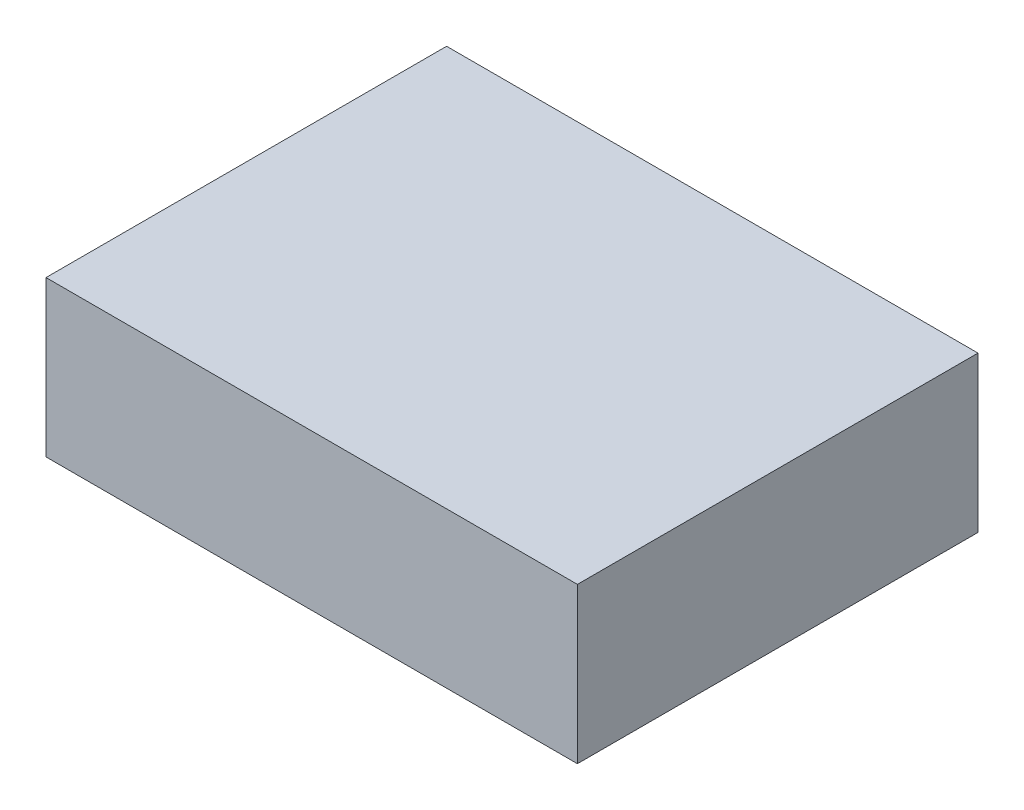
ISO-10303-21;
HEADER;
FILE_DESCRIPTION(('STEP AP214'),'2;1');
FILE_NAME('part.step','',(''),(''),'','','');
FILE_SCHEMA(('AUTOMOTIVE_DESIGN { 1 0 10303 214 1 1 1 1 }'));
ENDSEC;
DATA;
#1=APPLICATION_CONTEXT('core data for automotive mechanical design processes');
#2=APPLICATION_PROTOCOL_DEFINITION('international standard','automotive_design',2000,#1);
#3=PRODUCT_CONTEXT('',#1,'mechanical');
#4=PRODUCT('Part','Part','',(#3));
#5=PRODUCT_RELATED_PRODUCT_CATEGORY('part','',(#4));
#6=PRODUCT_DEFINITION_FORMATION('','',#4);
#7=PRODUCT_DEFINITION_CONTEXT('part definition',#1,'design');
#8=PRODUCT_DEFINITION('design','',#6,#7);
#9=PRODUCT_DEFINITION_SHAPE('','',#8);
#10=(LENGTH_UNIT() NAMED_UNIT(*) SI_UNIT(.MILLI.,.METRE.));
#11=(NAMED_UNIT(*) PLANE_ANGLE_UNIT() SI_UNIT($,.RADIAN.));
#12=(NAMED_UNIT(*) SI_UNIT($,.STERADIAN.) SOLID_ANGLE_UNIT());
#13=UNCERTAINTY_MEASURE_WITH_UNIT(LENGTH_MEASURE(1.E-05),#10,'distance_accuracy_value','');
#14=(GEOMETRIC_REPRESENTATION_CONTEXT(3) GLOBAL_UNCERTAINTY_ASSIGNED_CONTEXT((#13)) GLOBAL_UNIT_ASSIGNED_CONTEXT((#10,
#11,#12)) REPRESENTATION_CONTEXT('',''));
#15=CARTESIAN_POINT('',(0.,0.,0.));
#16=DIRECTION('',(0.,0.,1.));
#17=DIRECTION('',(1.,0.,0.));
#18=AXIS2_PLACEMENT_3D('',#15,#16,#17);
#19=CARTESIAN_POINT('',(65.,38.,-49.));
#20=DIRECTION('',(0.,0.,1.));
#21=DIRECTION('',(1.,0.,0.));
#22=AXIS2_PLACEMENT_3D('',#19,#20,#21);
#23=PLANE('',#22);
#24=DIRECTION('',(-1.,0.,0.));
#25=VECTOR('',#24,1.);
#26=CARTESIAN_POINT('',(65.,0.,-49.));
#27=LINE('',#26,#25);
#28=CARTESIAN_POINT('',(65.,0.,-49.));
#29=VERTEX_POINT('',#28);
#30=CARTESIAN_POINT('',(-65.,0.,-49.));
#31=VERTEX_POINT('',#30);
#32=EDGE_CURVE('E113',#29,#31,#27,.T.);
#33=ORIENTED_EDGE('',*,*,#32,.T.);
#34=DIRECTION('',(0.,-1.,0.));
#35=VECTOR('',#34,1.);
#36=CARTESIAN_POINT('',(-65.,38.,-49.));
#37=LINE('',#36,#35);
#38=CARTESIAN_POINT('',(-65.,38.,-49.));
#39=VERTEX_POINT('',#38);
#40=EDGE_CURVE('E11',#39,#31,#37,.T.);
#41=ORIENTED_EDGE('',*,*,#40,.F.);
#42=DIRECTION('',(-1.,0.,0.));
#43=VECTOR('',#42,1.);
#44=CARTESIAN_POINT('',(65.,38.,-49.));
#45=LINE('',#44,#43);
#46=CARTESIAN_POINT('',(65.,38.,-49.));
#47=VERTEX_POINT('',#46);
#48=EDGE_CURVE('E97',#47,#39,#45,.T.);
#49=ORIENTED_EDGE('',*,*,#48,.F.);
#50=DIRECTION('',(0.,-1.,0.));
#51=VECTOR('',#50,1.);
#52=CARTESIAN_POINT('',(65.,38.,-49.));
#53=LINE('',#52,#51);
#54=EDGE_CURVE('E109',#47,#29,#53,.T.);
#55=ORIENTED_EDGE('',*,*,#54,.T.);
#56=EDGE_LOOP('',(#33,#41,#49,#55));
#57=FACE_BOUND('',#56,.T.);
#58=ADVANCED_FACE('F45',(#57),#23,.F.);
#59=CARTESIAN_POINT('',(-65.,38.,-49.));
#60=DIRECTION('',(1.,0.,0.));
#61=DIRECTION('',(0.,0.,-1.));
#62=AXIS2_PLACEMENT_3D('',#59,#60,#61);
#63=PLANE('',#62);
#64=DIRECTION('',(0.,0.,1.));
#65=VECTOR('',#64,1.);
#66=CARTESIAN_POINT('',(-65.,0.,-49.));
#67=LINE('',#66,#65);
#68=CARTESIAN_POINT('',(-65.,0.,49.));
#69=VERTEX_POINT('',#68);
#70=EDGE_CURVE('E102',#31,#69,#67,.T.);
#71=ORIENTED_EDGE('',*,*,#70,.T.);
#72=DIRECTION('',(0.,-1.,0.));
#73=VECTOR('',#72,1.);
#74=CARTESIAN_POINT('',(-65.,38.,49.));
#75=LINE('',#74,#73);
#76=CARTESIAN_POINT('',(-65.,38.,49.));
#77=VERTEX_POINT('',#76);
#78=EDGE_CURVE('E54',#77,#69,#75,.T.);
#79=ORIENTED_EDGE('',*,*,#78,.F.);
#80=DIRECTION('',(0.,0.,1.));
#81=VECTOR('',#80,1.);
#82=CARTESIAN_POINT('',(-65.,38.,-49.));
#83=LINE('',#82,#81);
#84=EDGE_CURVE('E92',#39,#77,#83,.T.);
#85=ORIENTED_EDGE('',*,*,#84,.F.);
#86=ORIENTED_EDGE('',*,*,#40,.T.);
#87=EDGE_LOOP('',(#71,#79,#85,#86));
#88=FACE_BOUND('',#87,.T.);
#89=ADVANCED_FACE('F101',(#88),#63,.F.);
#90=CARTESIAN_POINT('',(-65.,38.,49.));
#91=DIRECTION('',(0.,0.,-1.));
#92=DIRECTION('',(-1.,0.,0.));
#93=AXIS2_PLACEMENT_3D('',#90,#91,#92);
#94=PLANE('',#93);
#95=DIRECTION('',(1.,0.,0.));
#96=VECTOR('',#95,1.);
#97=CARTESIAN_POINT('',(-65.,0.,49.));
#98=LINE('',#97,#96);
#99=CARTESIAN_POINT('',(65.,0.,49.));
#100=VERTEX_POINT('',#99);
#101=EDGE_CURVE('E79',#69,#100,#98,.T.);
#102=ORIENTED_EDGE('',*,*,#101,.T.);
#103=DIRECTION('',(0.,-1.,0.));
#104=VECTOR('',#103,1.);
#105=CARTESIAN_POINT('',(65.,38.,49.));
#106=LINE('',#105,#104);
#107=CARTESIAN_POINT('',(65.,38.,49.));
#108=VERTEX_POINT('',#107);
#109=EDGE_CURVE('E104',#108,#100,#106,.T.);
#110=ORIENTED_EDGE('',*,*,#109,.F.);
#111=DIRECTION('',(1.,0.,0.));
#112=VECTOR('',#111,1.);
#113=CARTESIAN_POINT('',(-65.,38.,49.));
#114=LINE('',#113,#112);
#115=EDGE_CURVE('E95',#77,#108,#114,.T.);
#116=ORIENTED_EDGE('',*,*,#115,.F.);
#117=ORIENTED_EDGE('',*,*,#78,.T.);
#118=EDGE_LOOP('',(#102,#110,#116,#117));
#119=FACE_BOUND('',#118,.T.);
#120=ADVANCED_FACE('F105',(#119),#94,.F.);
#121=CARTESIAN_POINT('',(65.,38.,49.));
#122=DIRECTION('',(-1.,0.,0.));
#123=DIRECTION('',(0.,0.,1.));
#124=AXIS2_PLACEMENT_3D('',#121,#122,#123);
#125=PLANE('',#124);
#126=DIRECTION('',(0.,0.,-1.));
#127=VECTOR('',#126,1.);
#128=CARTESIAN_POINT('',(65.,0.,49.));
#129=LINE('',#128,#127);
#130=EDGE_CURVE('E85',#100,#29,#129,.T.);
#131=ORIENTED_EDGE('',*,*,#130,.T.);
#132=ORIENTED_EDGE('',*,*,#54,.F.);
#133=DIRECTION('',(0.,0.,-1.));
#134=VECTOR('',#133,1.);
#135=CARTESIAN_POINT('',(65.,38.,49.));
#136=LINE('',#135,#134);
#137=EDGE_CURVE('E62',#108,#47,#136,.T.);
#138=ORIENTED_EDGE('',*,*,#137,.F.);
#139=ORIENTED_EDGE('',*,*,#109,.T.);
#140=EDGE_LOOP('',(#131,#132,#138,#139));
#141=FACE_BOUND('',#140,.T.);
#142=ADVANCED_FACE('F126',(#141),#125,.F.);
#143=CARTESIAN_POINT('',(0.,38.,0.));
#144=DIRECTION('',(0.,1.,0.));
#145=DIRECTION('',(0.,0.,1.));
#146=AXIS2_PLACEMENT_3D('',#143,#144,#145);
#147=PLANE('',#146);
#148=ORIENTED_EDGE('',*,*,#48,.T.);
#149=ORIENTED_EDGE('',*,*,#84,.T.);
#150=ORIENTED_EDGE('',*,*,#115,.T.);
#151=ORIENTED_EDGE('',*,*,#137,.T.);
#152=EDGE_LOOP('',(#148,#149,#150,#151));
#153=FACE_BOUND('',#152,.T.);
#154=ADVANCED_FACE('F93',(#153),#147,.T.);
#155=CARTESIAN_POINT('',(0.,0.,0.));
#156=DIRECTION('',(0.,1.,0.));
#157=DIRECTION('',(0.,0.,1.));
#158=AXIS2_PLACEMENT_3D('',#155,#156,#157);
#159=PLANE('',#158);
#160=ORIENTED_EDGE('',*,*,#32,.F.);
#161=ORIENTED_EDGE('',*,*,#130,.F.);
#162=ORIENTED_EDGE('',*,*,#101,.F.);
#163=ORIENTED_EDGE('',*,*,#70,.F.);
#164=EDGE_LOOP('',(#160,#161,#162,#163));
#165=FACE_BOUND('',#164,.T.);
#166=ADVANCED_FACE('F129',(#165),#159,.F.);
#167=CLOSED_SHELL('',(#58,#89,#120,#142,#154,#166));
#168=MANIFOLD_SOLID_BREP('B2',#167);
#169=ADVANCED_BREP_SHAPE_REPRESENTATION('',(#18,#168),#14);
#170=SHAPE_DEFINITION_REPRESENTATION(#9,#169);
ENDSEC;
END-ISO-10303-21;
